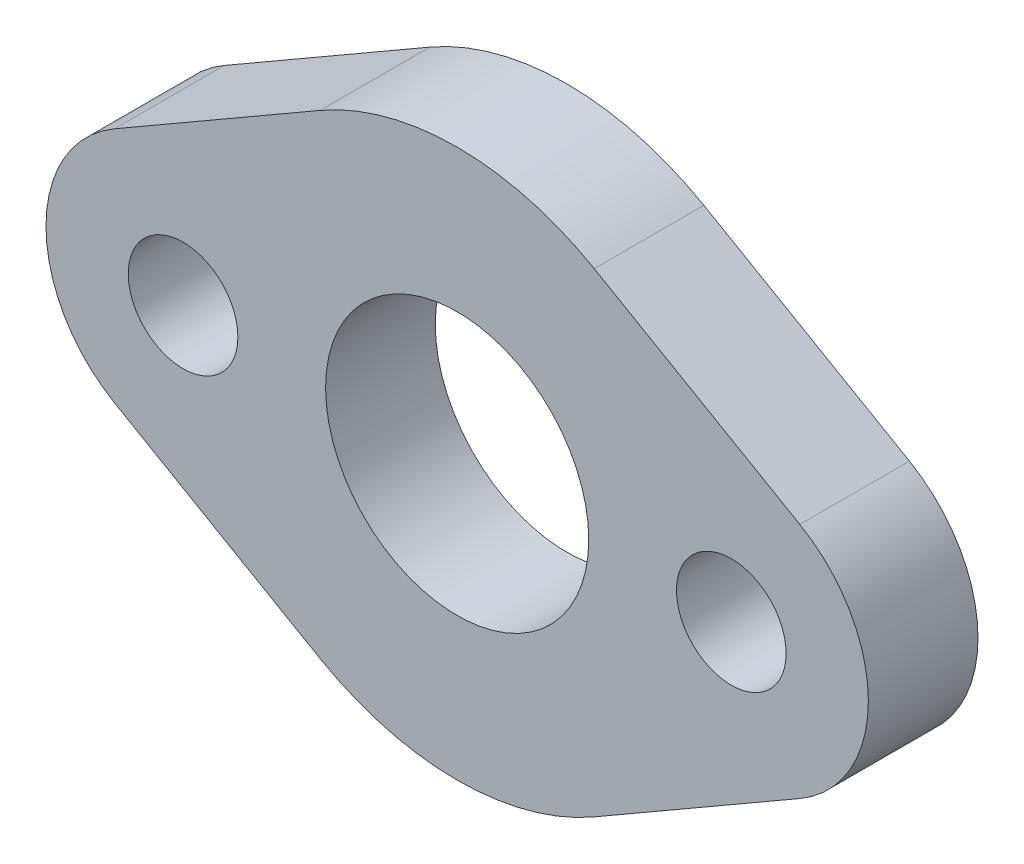
ISO-10303-21;
HEADER;
FILE_DESCRIPTION(('STEP AP214'),'2;1');
FILE_NAME('part.step','',(''),(''),'','','');
FILE_SCHEMA(('AUTOMOTIVE_DESIGN { 1 0 10303 214 1 1 1 1 }'));
ENDSEC;
DATA;
#1=APPLICATION_CONTEXT('core data for automotive mechanical design processes');
#2=APPLICATION_PROTOCOL_DEFINITION('international standard','automotive_design',2000,#1);
#3=PRODUCT_CONTEXT('',#1,'mechanical');
#4=PRODUCT('Part','Part','',(#3));
#5=PRODUCT_RELATED_PRODUCT_CATEGORY('part','',(#4));
#6=PRODUCT_DEFINITION_FORMATION('','',#4);
#7=PRODUCT_DEFINITION_CONTEXT('part definition',#1,'design');
#8=PRODUCT_DEFINITION('design','',#6,#7);
#9=PRODUCT_DEFINITION_SHAPE('','',#8);
#10=(LENGTH_UNIT() NAMED_UNIT(*) SI_UNIT(.MILLI.,.METRE.));
#11=(NAMED_UNIT(*) PLANE_ANGLE_UNIT() SI_UNIT($,.RADIAN.));
#12=(NAMED_UNIT(*) SI_UNIT($,.STERADIAN.) SOLID_ANGLE_UNIT());
#13=UNCERTAINTY_MEASURE_WITH_UNIT(LENGTH_MEASURE(1.E-05),#10,'distance_accuracy_value','');
#14=(GEOMETRIC_REPRESENTATION_CONTEXT(3) GLOBAL_UNCERTAINTY_ASSIGNED_CONTEXT((#13)) GLOBAL_UNIT_ASSIGNED_CONTEXT((#10,
#11,#12)) REPRESENTATION_CONTEXT('',''));
#15=CARTESIAN_POINT('',(0.,0.,0.));
#16=DIRECTION('',(0.,0.,1.));
#17=DIRECTION('',(1.,0.,0.));
#18=AXIS2_PLACEMENT_3D('',#15,#16,#17);
#19=CARTESIAN_POINT('',(0.,0.,2.));
#20=DIRECTION('',(0.,0.,1.));
#21=DIRECTION('',(1.,0.,0.));
#22=AXIS2_PLACEMENT_3D('',#19,#20,#21);
#23=PLANE('',#22);
#24=CARTESIAN_POINT('',(-5.,0.,2.));
#25=DIRECTION('',(0.,0.,1.));
#26=DIRECTION('',(1.,0.,0.));
#27=AXIS2_PLACEMENT_3D('',#24,#25,#26);
#28=CIRCLE('',#27,1.);
#29=CARTESIAN_POINT('',(-4.,0.,2.));
#30=VERTEX_POINT('',#29);
#31=EDGE_CURVE('E184',#30,#30,#28,.T.);
#32=ORIENTED_EDGE('',*,*,#31,.F.);
#33=EDGE_LOOP('',(#32));
#34=FACE_BOUND('',#33,.T.);
#35=CARTESIAN_POINT('',(0.,0.,2.));
#36=DIRECTION('',(0.,0.,1.));
#37=DIRECTION('',(1.,0.,0.));
#38=AXIS2_PLACEMENT_3D('',#35,#36,#37);
#39=CIRCLE('',#38,5.);
#40=CARTESIAN_POINT('',(2.5,4.33012701892219,2.));
#41=VERTEX_POINT('',#40);
#42=CARTESIAN_POINT('',(-2.5,4.33012701892219,2.));
#43=VERTEX_POINT('',#42);
#44=EDGE_CURVE('E147',#41,#43,#39,.T.);
#45=ORIENTED_EDGE('',*,*,#44,.T.);
#46=DIRECTION('',(-0.866025403784439,-0.499999999999999,0.));
#47=VECTOR('',#46,1.);
#48=CARTESIAN_POINT('',(-6.25,2.1650635094611,2.));
#49=LINE('',#48,#47);
#50=CARTESIAN_POINT('',(-6.25,2.1650635094611,2.));
#51=VERTEX_POINT('',#50);
#52=EDGE_CURVE('E95',#43,#51,#49,.T.);
#53=ORIENTED_EDGE('',*,*,#52,.T.);
#54=CARTESIAN_POINT('',(-5.,0.,2.));
#55=DIRECTION('',(0.,0.,1.));
#56=DIRECTION('',(-1.,0.,0.));
#57=AXIS2_PLACEMENT_3D('',#54,#55,#56);
#58=CIRCLE('',#57,2.5);
#59=CARTESIAN_POINT('',(-6.25,-2.1650635094611,2.));
#60=VERTEX_POINT('',#59);
#61=EDGE_CURVE('E162',#51,#60,#58,.T.);
#62=ORIENTED_EDGE('',*,*,#61,.T.);
#63=DIRECTION('',(0.866025403784439,-0.499999999999999,0.));
#64=VECTOR('',#63,1.);
#65=CARTESIAN_POINT('',(-6.25,-2.1650635094611,2.));
#66=LINE('',#65,#64);
#67=CARTESIAN_POINT('',(-2.5,-4.33012701892219,2.));
#68=VERTEX_POINT('',#67);
#69=EDGE_CURVE('E175',#60,#68,#66,.T.);
#70=ORIENTED_EDGE('',*,*,#69,.T.);
#71=CARTESIAN_POINT('',(0.,0.,2.));
#72=DIRECTION('',(0.,0.,1.));
#73=DIRECTION('',(1.,0.,0.));
#74=AXIS2_PLACEMENT_3D('',#71,#72,#73);
#75=CIRCLE('',#74,5.);
#76=CARTESIAN_POINT('',(2.5,-4.33012701892219,2.));
#77=VERTEX_POINT('',#76);
#78=EDGE_CURVE('E114',#68,#77,#75,.T.);
#79=ORIENTED_EDGE('',*,*,#78,.T.);
#80=DIRECTION('',(0.866025403784439,0.499999999999999,0.));
#81=VECTOR('',#80,1.);
#82=CARTESIAN_POINT('',(6.25,-2.1650635094611,2.));
#83=LINE('',#82,#81);
#84=CARTESIAN_POINT('',(6.25,-2.1650635094611,2.));
#85=VERTEX_POINT('',#84);
#86=EDGE_CURVE('E108',#77,#85,#83,.T.);
#87=ORIENTED_EDGE('',*,*,#86,.T.);
#88=CARTESIAN_POINT('',(5.,0.,2.));
#89=DIRECTION('',(0.,0.,1.));
#90=DIRECTION('',(1.,0.,0.));
#91=AXIS2_PLACEMENT_3D('',#88,#89,#90);
#92=CIRCLE('',#91,2.5);
#93=CARTESIAN_POINT('',(6.25,2.1650635094611,2.));
#94=VERTEX_POINT('',#93);
#95=EDGE_CURVE('E112',#85,#94,#92,.T.);
#96=ORIENTED_EDGE('',*,*,#95,.T.);
#97=DIRECTION('',(-0.866025403784439,0.499999999999999,0.));
#98=VECTOR('',#97,1.);
#99=CARTESIAN_POINT('',(2.5,4.33012701892219,2.));
#100=LINE('',#99,#98);
#101=EDGE_CURVE('E52',#94,#41,#100,.T.);
#102=ORIENTED_EDGE('',*,*,#101,.T.);
#103=EDGE_LOOP('',(#45,#53,#62,#70,#79,#87,#96,#102));
#104=FACE_BOUND('',#103,.T.);
#105=CARTESIAN_POINT('',(0.,0.,2.));
#106=DIRECTION('',(0.,0.,1.));
#107=DIRECTION('',(1.,0.,0.));
#108=AXIS2_PLACEMENT_3D('',#105,#106,#107);
#109=CIRCLE('',#108,2.4);
#110=CARTESIAN_POINT('',(2.4,0.,2.));
#111=VERTEX_POINT('',#110);
#112=EDGE_CURVE('E136',#111,#111,#109,.T.);
#113=ORIENTED_EDGE('',*,*,#112,.F.);
#114=EDGE_LOOP('',(#113));
#115=FACE_BOUND('',#114,.T.);
#116=CARTESIAN_POINT('',(5.,0.,2.));
#117=DIRECTION('',(0.,0.,1.));
#118=DIRECTION('',(1.,0.,0.));
#119=AXIS2_PLACEMENT_3D('',#116,#117,#118);
#120=CIRCLE('',#119,1.);
#121=CARTESIAN_POINT('',(6.,0.,2.));
#122=VERTEX_POINT('',#121);
#123=EDGE_CURVE('E190',#122,#122,#120,.T.);
#124=ORIENTED_EDGE('',*,*,#123,.F.);
#125=EDGE_LOOP('',(#124));
#126=FACE_BOUND('',#125,.T.);
#127=ADVANCED_FACE('F35',(#34,#104,#115,#126),#23,.T.);
#128=CARTESIAN_POINT('',(0.,0.,0.));
#129=DIRECTION('',(0.,0.,1.));
#130=DIRECTION('',(1.,0.,0.));
#131=AXIS2_PLACEMENT_3D('',#128,#129,#130);
#132=PLANE('',#131);
#133=CARTESIAN_POINT('',(0.,0.,0.));
#134=DIRECTION('',(0.,0.,1.));
#135=DIRECTION('',(1.,0.,0.));
#136=AXIS2_PLACEMENT_3D('',#133,#134,#135);
#137=CIRCLE('',#136,5.);
#138=CARTESIAN_POINT('',(2.5,4.33012701892219,0.));
#139=VERTEX_POINT('',#138);
#140=CARTESIAN_POINT('',(-2.5,4.33012701892219,0.));
#141=VERTEX_POINT('',#140);
#142=EDGE_CURVE('E132',#139,#141,#137,.T.);
#143=ORIENTED_EDGE('',*,*,#142,.F.);
#144=DIRECTION('',(-0.866025403784439,0.499999999999999,0.));
#145=VECTOR('',#144,1.);
#146=CARTESIAN_POINT('',(2.5,4.33012701892219,0.));
#147=LINE('',#146,#145);
#148=CARTESIAN_POINT('',(6.25,2.1650635094611,0.));
#149=VERTEX_POINT('',#148);
#150=EDGE_CURVE('E87',#149,#139,#147,.T.);
#151=ORIENTED_EDGE('',*,*,#150,.F.);
#152=CARTESIAN_POINT('',(5.,0.,0.));
#153=DIRECTION('',(0.,0.,1.));
#154=DIRECTION('',(1.,0.,0.));
#155=AXIS2_PLACEMENT_3D('',#152,#153,#154);
#156=CIRCLE('',#155,2.5);
#157=CARTESIAN_POINT('',(6.25,-2.1650635094611,0.));
#158=VERTEX_POINT('',#157);
#159=EDGE_CURVE('E81',#158,#149,#156,.T.);
#160=ORIENTED_EDGE('',*,*,#159,.F.);
#161=DIRECTION('',(0.866025403784439,0.499999999999999,0.));
#162=VECTOR('',#161,1.);
#163=CARTESIAN_POINT('',(6.25,-2.1650635094611,0.));
#164=LINE('',#163,#162);
#165=CARTESIAN_POINT('',(2.5,-4.33012701892219,0.));
#166=VERTEX_POINT('',#165);
#167=EDGE_CURVE('E122',#166,#158,#164,.T.);
#168=ORIENTED_EDGE('',*,*,#167,.F.);
#169=CARTESIAN_POINT('',(0.,0.,0.));
#170=DIRECTION('',(0.,0.,1.));
#171=DIRECTION('',(1.,0.,0.));
#172=AXIS2_PLACEMENT_3D('',#169,#170,#171);
#173=CIRCLE('',#172,5.);
#174=CARTESIAN_POINT('',(-2.5,-4.33012701892219,0.));
#175=VERTEX_POINT('',#174);
#176=EDGE_CURVE('E142',#175,#166,#173,.T.);
#177=ORIENTED_EDGE('',*,*,#176,.F.);
#178=DIRECTION('',(0.866025403784439,-0.499999999999999,0.));
#179=VECTOR('',#178,1.);
#180=CARTESIAN_POINT('',(-6.25,-2.1650635094611,0.));
#181=LINE('',#180,#179);
#182=CARTESIAN_POINT('',(-6.25,-2.1650635094611,0.));
#183=VERTEX_POINT('',#182);
#184=EDGE_CURVE('E140',#183,#175,#181,.T.);
#185=ORIENTED_EDGE('',*,*,#184,.F.);
#186=CARTESIAN_POINT('',(-5.,0.,0.));
#187=DIRECTION('',(0.,0.,1.));
#188=DIRECTION('',(-1.,0.,0.));
#189=AXIS2_PLACEMENT_3D('',#186,#187,#188);
#190=CIRCLE('',#189,2.5);
#191=CARTESIAN_POINT('',(-6.25,2.1650635094611,0.));
#192=VERTEX_POINT('',#191);
#193=EDGE_CURVE('E138',#192,#183,#190,.T.);
#194=ORIENTED_EDGE('',*,*,#193,.F.);
#195=DIRECTION('',(-0.866025403784439,-0.499999999999999,0.));
#196=VECTOR('',#195,1.);
#197=CARTESIAN_POINT('',(-6.25,2.1650635094611,0.));
#198=LINE('',#197,#196);
#199=EDGE_CURVE('E135',#141,#192,#198,.T.);
#200=ORIENTED_EDGE('',*,*,#199,.F.);
#201=EDGE_LOOP('',(#143,#151,#160,#168,#177,#185,#194,#200));
#202=FACE_BOUND('',#201,.T.);
#203=CARTESIAN_POINT('',(0.,0.,0.));
#204=DIRECTION('',(0.,0.,1.));
#205=DIRECTION('',(1.,0.,0.));
#206=AXIS2_PLACEMENT_3D('',#203,#204,#205);
#207=CIRCLE('',#206,2.4);
#208=CARTESIAN_POINT('',(2.4,0.,0.));
#209=VERTEX_POINT('',#208);
#210=EDGE_CURVE('E181',#209,#209,#207,.T.);
#211=ORIENTED_EDGE('',*,*,#210,.T.);
#212=EDGE_LOOP('',(#211));
#213=FACE_BOUND('',#212,.T.);
#214=CARTESIAN_POINT('',(-5.,0.,0.));
#215=DIRECTION('',(0.,0.,1.));
#216=DIRECTION('',(1.,0.,0.));
#217=AXIS2_PLACEMENT_3D('',#214,#215,#216);
#218=CIRCLE('',#217,1.);
#219=CARTESIAN_POINT('',(-4.,0.,0.));
#220=VERTEX_POINT('',#219);
#221=EDGE_CURVE('E187',#220,#220,#218,.T.);
#222=ORIENTED_EDGE('',*,*,#221,.T.);
#223=EDGE_LOOP('',(#222));
#224=FACE_BOUND('',#223,.T.);
#225=CARTESIAN_POINT('',(5.,0.,0.));
#226=DIRECTION('',(0.,0.,1.));
#227=DIRECTION('',(1.,0.,0.));
#228=AXIS2_PLACEMENT_3D('',#225,#226,#227);
#229=CIRCLE('',#228,1.);
#230=CARTESIAN_POINT('',(6.,0.,0.));
#231=VERTEX_POINT('',#230);
#232=EDGE_CURVE('E193',#231,#231,#229,.T.);
#233=ORIENTED_EDGE('',*,*,#232,.T.);
#234=EDGE_LOOP('',(#233));
#235=FACE_BOUND('',#234,.T.);
#236=ADVANCED_FACE('F166',(#202,#213,#224,#235),#132,.F.);
#237=CARTESIAN_POINT('',(0.,0.,2.));
#238=DIRECTION('',(0.,0.,-1.));
#239=DIRECTION('',(-1.,0.,0.));
#240=AXIS2_PLACEMENT_3D('',#237,#238,#239);
#241=CYLINDRICAL_SURFACE('',#240,5.);
#242=ORIENTED_EDGE('',*,*,#142,.T.);
#243=DIRECTION('',(0.,0.,-1.));
#244=VECTOR('',#243,1.);
#245=CARTESIAN_POINT('',(-2.5,4.33012701892219,2.));
#246=LINE('',#245,#244);
#247=EDGE_CURVE('E11',#43,#141,#246,.T.);
#248=ORIENTED_EDGE('',*,*,#247,.F.);
#249=ORIENTED_EDGE('',*,*,#44,.F.);
#250=DIRECTION('',(0.,0.,-1.));
#251=VECTOR('',#250,1.);
#252=CARTESIAN_POINT('',(2.5,4.33012701892219,2.));
#253=LINE('',#252,#251);
#254=EDGE_CURVE('E128',#41,#139,#253,.T.);
#255=ORIENTED_EDGE('',*,*,#254,.T.);
#256=EDGE_LOOP('',(#242,#248,#249,#255));
#257=FACE_BOUND('',#256,.T.);
#258=ADVANCED_FACE('F37',(#257),#241,.T.);
#259=CARTESIAN_POINT('',(-6.25,2.1650635094611,2.));
#260=DIRECTION('',(0.499999999999999,-0.866025403784439,0.));
#261=DIRECTION('',(0.866025403784439,0.499999999999999,0.));
#262=AXIS2_PLACEMENT_3D('',#259,#260,#261);
#263=PLANE('',#262);
#264=ORIENTED_EDGE('',*,*,#199,.T.);
#265=DIRECTION('',(0.,0.,-1.));
#266=VECTOR('',#265,1.);
#267=CARTESIAN_POINT('',(-6.25,2.1650635094611,2.));
#268=LINE('',#267,#266);
#269=EDGE_CURVE('E44',#51,#192,#268,.T.);
#270=ORIENTED_EDGE('',*,*,#269,.F.);
#271=ORIENTED_EDGE('',*,*,#52,.F.);
#272=ORIENTED_EDGE('',*,*,#247,.T.);
#273=EDGE_LOOP('',(#264,#270,#271,#272));
#274=FACE_BOUND('',#273,.T.);
#275=ADVANCED_FACE('F226',(#274),#263,.F.);
#276=CARTESIAN_POINT('',(-5.,0.,2.));
#277=DIRECTION('',(0.,0.,-1.));
#278=DIRECTION('',(-1.,0.,0.));
#279=AXIS2_PLACEMENT_3D('',#276,#277,#278);
#280=CYLINDRICAL_SURFACE('',#279,2.5);
#281=ORIENTED_EDGE('',*,*,#193,.T.);
#282=DIRECTION('',(0.,0.,-1.));
#283=VECTOR('',#282,1.);
#284=CARTESIAN_POINT('',(-6.25,-2.1650635094611,2.));
#285=LINE('',#284,#283);
#286=EDGE_CURVE('E154',#60,#183,#285,.T.);
#287=ORIENTED_EDGE('',*,*,#286,.F.);
#288=ORIENTED_EDGE('',*,*,#61,.F.);
#289=ORIENTED_EDGE('',*,*,#269,.T.);
#290=EDGE_LOOP('',(#281,#287,#288,#289));
#291=FACE_BOUND('',#290,.T.);
#292=ADVANCED_FACE('F160',(#291),#280,.T.);
#293=CARTESIAN_POINT('',(-6.25,-2.1650635094611,2.));
#294=DIRECTION('',(0.499999999999999,0.866025403784439,0.));
#295=DIRECTION('',(-0.866025403784439,0.499999999999999,0.));
#296=AXIS2_PLACEMENT_3D('',#293,#294,#295);
#297=PLANE('',#296);
#298=ORIENTED_EDGE('',*,*,#184,.T.);
#299=DIRECTION('',(0.,0.,-1.));
#300=VECTOR('',#299,1.);
#301=CARTESIAN_POINT('',(-2.5,-4.33012701892219,2.));
#302=LINE('',#301,#300);
#303=EDGE_CURVE('E151',#68,#175,#302,.T.);
#304=ORIENTED_EDGE('',*,*,#303,.F.);
#305=ORIENTED_EDGE('',*,*,#69,.F.);
#306=ORIENTED_EDGE('',*,*,#286,.T.);
#307=EDGE_LOOP('',(#298,#304,#305,#306));
#308=FACE_BOUND('',#307,.T.);
#309=ADVANCED_FACE('F171',(#308),#297,.F.);
#310=CARTESIAN_POINT('',(0.,0.,2.));
#311=DIRECTION('',(0.,0.,-1.));
#312=DIRECTION('',(-1.,0.,0.));
#313=AXIS2_PLACEMENT_3D('',#310,#311,#312);
#314=CYLINDRICAL_SURFACE('',#313,5.);
#315=ORIENTED_EDGE('',*,*,#176,.T.);
#316=DIRECTION('',(0.,0.,-1.));
#317=VECTOR('',#316,1.);
#318=CARTESIAN_POINT('',(2.5,-4.33012701892219,2.));
#319=LINE('',#318,#317);
#320=EDGE_CURVE('E123',#77,#166,#319,.T.);
#321=ORIENTED_EDGE('',*,*,#320,.F.);
#322=ORIENTED_EDGE('',*,*,#78,.F.);
#323=ORIENTED_EDGE('',*,*,#303,.T.);
#324=EDGE_LOOP('',(#315,#321,#322,#323));
#325=FACE_BOUND('',#324,.T.);
#326=ADVANCED_FACE('F174',(#325),#314,.T.);
#327=CARTESIAN_POINT('',(6.25,-2.1650635094611,2.));
#328=DIRECTION('',(-0.499999999999999,0.866025403784439,0.));
#329=DIRECTION('',(-0.866025403784439,-0.499999999999999,0.));
#330=AXIS2_PLACEMENT_3D('',#327,#328,#329);
#331=PLANE('',#330);
#332=ORIENTED_EDGE('',*,*,#167,.T.);
#333=DIRECTION('',(0.,0.,-1.));
#334=VECTOR('',#333,1.);
#335=CARTESIAN_POINT('',(6.25,-2.1650635094611,2.));
#336=LINE('',#335,#334);
#337=EDGE_CURVE('E119',#85,#158,#336,.T.);
#338=ORIENTED_EDGE('',*,*,#337,.F.);
#339=ORIENTED_EDGE('',*,*,#86,.F.);
#340=ORIENTED_EDGE('',*,*,#320,.T.);
#341=EDGE_LOOP('',(#332,#338,#339,#340));
#342=FACE_BOUND('',#341,.T.);
#343=ADVANCED_FACE('F120',(#342),#331,.F.);
#344=CARTESIAN_POINT('',(5.,0.,2.));
#345=DIRECTION('',(0.,0.,-1.));
#346=DIRECTION('',(-1.,0.,0.));
#347=AXIS2_PLACEMENT_3D('',#344,#345,#346);
#348=CYLINDRICAL_SURFACE('',#347,2.5);
#349=ORIENTED_EDGE('',*,*,#159,.T.);
#350=DIRECTION('',(0.,0.,-1.));
#351=VECTOR('',#350,1.);
#352=CARTESIAN_POINT('',(6.25,2.1650635094611,2.));
#353=LINE('',#352,#351);
#354=EDGE_CURVE('E124',#94,#149,#353,.T.);
#355=ORIENTED_EDGE('',*,*,#354,.F.);
#356=ORIENTED_EDGE('',*,*,#95,.F.);
#357=ORIENTED_EDGE('',*,*,#337,.T.);
#358=EDGE_LOOP('',(#349,#355,#356,#357));
#359=FACE_BOUND('',#358,.T.);
#360=ADVANCED_FACE('F126',(#359),#348,.T.);
#361=CARTESIAN_POINT('',(2.5,4.33012701892219,2.));
#362=DIRECTION('',(-0.499999999999999,-0.866025403784439,0.));
#363=DIRECTION('',(0.866025403784439,-0.499999999999999,0.));
#364=AXIS2_PLACEMENT_3D('',#361,#362,#363);
#365=PLANE('',#364);
#366=ORIENTED_EDGE('',*,*,#150,.T.);
#367=ORIENTED_EDGE('',*,*,#254,.F.);
#368=ORIENTED_EDGE('',*,*,#101,.F.);
#369=ORIENTED_EDGE('',*,*,#354,.T.);
#370=EDGE_LOOP('',(#366,#367,#368,#369));
#371=FACE_BOUND('',#370,.T.);
#372=ADVANCED_FACE('F214',(#371),#365,.F.);
#373=CARTESIAN_POINT('',(0.,0.,2.));
#374=DIRECTION('',(0.,0.,-1.));
#375=DIRECTION('',(-1.,0.,0.));
#376=AXIS2_PLACEMENT_3D('',#373,#374,#375);
#377=CYLINDRICAL_SURFACE('',#376,2.4);
#378=ORIENTED_EDGE('',*,*,#112,.T.);
#379=EDGE_LOOP('',(#378));
#380=FACE_BOUND('',#379,.T.);
#381=ORIENTED_EDGE('',*,*,#210,.F.);
#382=EDGE_LOOP('',(#381));
#383=FACE_BOUND('',#382,.T.);
#384=ADVANCED_FACE('F211',(#380,#383),#377,.F.);
#385=CARTESIAN_POINT('',(-5.,0.,2.));
#386=DIRECTION('',(0.,0.,-1.));
#387=DIRECTION('',(-1.,0.,0.));
#388=AXIS2_PLACEMENT_3D('',#385,#386,#387);
#389=CYLINDRICAL_SURFACE('',#388,1.);
#390=ORIENTED_EDGE('',*,*,#31,.T.);
#391=EDGE_LOOP('',(#390));
#392=FACE_BOUND('',#391,.T.);
#393=ORIENTED_EDGE('',*,*,#221,.F.);
#394=EDGE_LOOP('',(#393));
#395=FACE_BOUND('',#394,.T.);
#396=ADVANCED_FACE('F290',(#392,#395),#389,.F.);
#397=CARTESIAN_POINT('',(5.,0.,2.));
#398=DIRECTION('',(0.,0.,-1.));
#399=DIRECTION('',(-1.,0.,0.));
#400=AXIS2_PLACEMENT_3D('',#397,#398,#399);
#401=CYLINDRICAL_SURFACE('',#400,1.);
#402=ORIENTED_EDGE('',*,*,#123,.T.);
#403=EDGE_LOOP('',(#402));
#404=FACE_BOUND('',#403,.T.);
#405=ORIENTED_EDGE('',*,*,#232,.F.);
#406=EDGE_LOOP('',(#405));
#407=FACE_BOUND('',#406,.T.);
#408=ADVANCED_FACE('F199',(#404,#407),#401,.F.);
#409=CLOSED_SHELL('',(#127,#236,#258,#275,#292,#309,#326,#343,#360,#372,#384,#396,#408));
#410=MANIFOLD_SOLID_BREP('B2',#409);
#411=ADVANCED_BREP_SHAPE_REPRESENTATION('',(#18,#410),#14);
#412=SHAPE_DEFINITION_REPRESENTATION(#9,#411);
ENDSEC;
END-ISO-10303-21;
